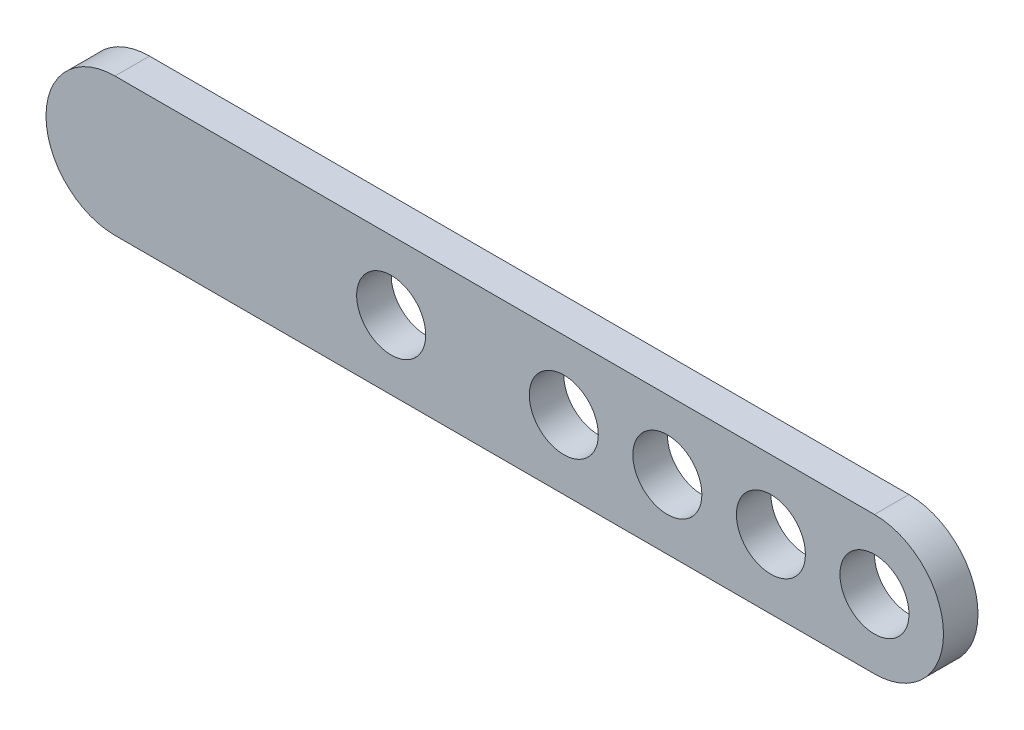
ISO-10303-21;
HEADER;
FILE_DESCRIPTION(('STEP AP214'),'2;1');
FILE_NAME('part.step','',(''),(''),'','','');
FILE_SCHEMA(('AUTOMOTIVE_DESIGN { 1 0 10303 214 1 1 1 1 }'));
ENDSEC;
DATA;
#1=APPLICATION_CONTEXT('core data for automotive mechanical design processes');
#2=APPLICATION_PROTOCOL_DEFINITION('international standard','automotive_design',2000,#1);
#3=PRODUCT_CONTEXT('',#1,'mechanical');
#4=PRODUCT('Part','Part','',(#3));
#5=PRODUCT_RELATED_PRODUCT_CATEGORY('part','',(#4));
#6=PRODUCT_DEFINITION_FORMATION('','',#4);
#7=PRODUCT_DEFINITION_CONTEXT('part definition',#1,'design');
#8=PRODUCT_DEFINITION('design','',#6,#7);
#9=PRODUCT_DEFINITION_SHAPE('','',#8);
#10=(LENGTH_UNIT() NAMED_UNIT(*) SI_UNIT(.MILLI.,.METRE.));
#11=(NAMED_UNIT(*) PLANE_ANGLE_UNIT() SI_UNIT($,.RADIAN.));
#12=(NAMED_UNIT(*) SI_UNIT($,.STERADIAN.) SOLID_ANGLE_UNIT());
#13=UNCERTAINTY_MEASURE_WITH_UNIT(LENGTH_MEASURE(1.E-05),#10,'distance_accuracy_value','');
#14=(GEOMETRIC_REPRESENTATION_CONTEXT(3) GLOBAL_UNCERTAINTY_ASSIGNED_CONTEXT((#13)) GLOBAL_UNIT_ASSIGNED_CONTEXT((#10,
#11,#12)) REPRESENTATION_CONTEXT('',''));
#15=CARTESIAN_POINT('',(0.,0.,0.));
#16=DIRECTION('',(0.,0.,1.));
#17=DIRECTION('',(1.,0.,0.));
#18=AXIS2_PLACEMENT_3D('',#15,#16,#17);
#19=CARTESIAN_POINT('',(88.9,0.,12.7));
#20=DIRECTION('',(0.,0.,-1.));
#21=DIRECTION('',(-1.,0.,0.));
#22=AXIS2_PLACEMENT_3D('',#19,#20,#21);
#23=PLANE('',#22);
#24=CARTESIAN_POINT('',(88.9,0.,12.7));
#25=DIRECTION('',(0.,0.,1.));
#26=DIRECTION('',(-1.,0.,0.));
#27=AXIS2_PLACEMENT_3D('',#24,#25,#26);
#28=CIRCLE('',#27,25.3999999999999);
#29=CARTESIAN_POINT('',(88.9,-25.3999999999999,12.7));
#30=VERTEX_POINT('',#29);
#31=CARTESIAN_POINT('',(88.9,25.4,12.7));
#32=VERTEX_POINT('',#31);
#33=EDGE_CURVE('E86',#30,#32,#28,.T.);
#34=ORIENTED_EDGE('',*,*,#33,.T.);
#35=DIRECTION('',(-1.,0.,0.));
#36=VECTOR('',#35,1.);
#37=CARTESIAN_POINT('',(-88.9,25.4,12.7));
#38=LINE('',#37,#36);
#39=CARTESIAN_POINT('',(-190.5,25.3999999999999,12.7));
#40=VERTEX_POINT('',#39);
#41=EDGE_CURVE('E80',#32,#40,#38,.T.);
#42=ORIENTED_EDGE('',*,*,#41,.T.);
#43=CARTESIAN_POINT('',(-190.5,0.,12.7));
#44=DIRECTION('',(0.,0.,1.));
#45=DIRECTION('',(1.,0.,0.));
#46=AXIS2_PLACEMENT_3D('',#43,#44,#45);
#47=CIRCLE('',#46,25.4);
#48=CARTESIAN_POINT('',(-190.5,-25.4,12.7));
#49=VERTEX_POINT('',#48);
#50=EDGE_CURVE('E83',#40,#49,#47,.T.);
#51=ORIENTED_EDGE('',*,*,#50,.T.);
#52=DIRECTION('',(1.,0.,0.));
#53=VECTOR('',#52,1.);
#54=CARTESIAN_POINT('',(-88.9,-25.4,12.7));
#55=LINE('',#54,#53);
#56=EDGE_CURVE('E52',#49,#30,#55,.T.);
#57=ORIENTED_EDGE('',*,*,#56,.T.);
#58=EDGE_LOOP('',(#34,#42,#51,#57));
#59=FACE_BOUND('',#58,.T.);
#60=CARTESIAN_POINT('',(-88.9,0.,12.7));
#61=DIRECTION('',(0.,0.,1.));
#62=DIRECTION('',(1.,0.,0.));
#63=AXIS2_PLACEMENT_3D('',#60,#61,#62);
#64=CIRCLE('',#63,12.7);
#65=CARTESIAN_POINT('',(-76.2,0.,12.7));
#66=VERTEX_POINT('',#65);
#67=EDGE_CURVE('E103',#66,#66,#64,.T.);
#68=ORIENTED_EDGE('',*,*,#67,.F.);
#69=EDGE_LOOP('',(#68));
#70=FACE_BOUND('',#69,.T.);
#71=CARTESIAN_POINT('',(88.9,0.,12.7));
#72=DIRECTION('',(0.,0.,1.));
#73=DIRECTION('',(1.,0.,0.));
#74=AXIS2_PLACEMENT_3D('',#71,#72,#73);
#75=CIRCLE('',#74,12.7);
#76=CARTESIAN_POINT('',(101.6,0.,12.7));
#77=VERTEX_POINT('',#76);
#78=EDGE_CURVE('E115',#77,#77,#75,.T.);
#79=ORIENTED_EDGE('',*,*,#78,.F.);
#80=EDGE_LOOP('',(#79));
#81=FACE_BOUND('',#80,.T.);
#82=CARTESIAN_POINT('',(50.8,-2.71494433042057E-13,12.7));
#83=DIRECTION('',(0.,0.,1.));
#84=DIRECTION('',(1.,0.,0.));
#85=AXIS2_PLACEMENT_3D('',#82,#83,#84);
#86=CIRCLE('',#85,12.7);
#87=CARTESIAN_POINT('',(63.5,-2.71494433042057E-13,12.7));
#88=VERTEX_POINT('',#87);
#89=EDGE_CURVE('E121',#88,#88,#86,.T.);
#90=ORIENTED_EDGE('',*,*,#89,.F.);
#91=EDGE_LOOP('',(#90));
#92=FACE_BOUND('',#91,.T.);
#93=CARTESIAN_POINT('',(12.7,-5.37545311061903E-13,12.7));
#94=DIRECTION('',(0.,0.,1.));
#95=DIRECTION('',(1.,0.,0.));
#96=AXIS2_PLACEMENT_3D('',#93,#94,#95);
#97=CIRCLE('',#96,12.7);
#98=CARTESIAN_POINT('',(25.4,-5.37545311061903E-13,12.7));
#99=VERTEX_POINT('',#98);
#100=EDGE_CURVE('E127',#99,#99,#97,.T.);
#101=ORIENTED_EDGE('',*,*,#100,.F.);
#102=EDGE_LOOP('',(#101));
#103=FACE_BOUND('',#102,.T.);
#104=CARTESIAN_POINT('',(-25.4,-8.0359618908175E-13,12.7));
#105=DIRECTION('',(0.,0.,1.));
#106=DIRECTION('',(1.,0.,0.));
#107=AXIS2_PLACEMENT_3D('',#104,#105,#106);
#108=CIRCLE('',#107,12.7);
#109=CARTESIAN_POINT('',(-12.7,-8.0359618908175E-13,12.7));
#110=VERTEX_POINT('',#109);
#111=EDGE_CURVE('E133',#110,#110,#108,.T.);
#112=ORIENTED_EDGE('',*,*,#111,.F.);
#113=EDGE_LOOP('',(#112));
#114=FACE_BOUND('',#113,.T.);
#115=ADVANCED_FACE('F35',(#59,#70,#81,#92,#103,#114),#23,.F.);
#116=CARTESIAN_POINT('',(88.9,0.,0.));
#117=DIRECTION('',(0.,0.,-1.));
#118=DIRECTION('',(-1.,0.,0.));
#119=AXIS2_PLACEMENT_3D('',#116,#117,#118);
#120=PLANE('',#119);
#121=CARTESIAN_POINT('',(12.7,-5.37545311061903E-13,0.));
#122=DIRECTION('',(0.,0.,1.));
#123=DIRECTION('',(1.,0.,0.));
#124=AXIS2_PLACEMENT_3D('',#121,#122,#123);
#125=CIRCLE('',#124,12.7);
#126=CARTESIAN_POINT('',(25.4,-5.37545311061903E-13,0.));
#127=VERTEX_POINT('',#126);
#128=EDGE_CURVE('E130',#127,#127,#125,.T.);
#129=ORIENTED_EDGE('',*,*,#128,.T.);
#130=EDGE_LOOP('',(#129));
#131=FACE_BOUND('',#130,.T.);
#132=CARTESIAN_POINT('',(88.9,0.,0.));
#133=DIRECTION('',(0.,0.,1.));
#134=DIRECTION('',(1.,0.,0.));
#135=AXIS2_PLACEMENT_3D('',#132,#133,#134);
#136=CIRCLE('',#135,12.7);
#137=CARTESIAN_POINT('',(101.6,0.,0.));
#138=VERTEX_POINT('',#137);
#139=EDGE_CURVE('E118',#138,#138,#136,.T.);
#140=ORIENTED_EDGE('',*,*,#139,.T.);
#141=EDGE_LOOP('',(#140));
#142=FACE_BOUND('',#141,.T.);
#143=CARTESIAN_POINT('',(88.9,0.,0.));
#144=DIRECTION('',(0.,0.,1.));
#145=DIRECTION('',(-1.,0.,0.));
#146=AXIS2_PLACEMENT_3D('',#143,#144,#145);
#147=CIRCLE('',#146,25.3999999999999);
#148=CARTESIAN_POINT('',(88.9,-25.3999999999999,0.));
#149=VERTEX_POINT('',#148);
#150=CARTESIAN_POINT('',(88.9,25.4,0.));
#151=VERTEX_POINT('',#150);
#152=EDGE_CURVE('E100',#149,#151,#147,.T.);
#153=ORIENTED_EDGE('',*,*,#152,.F.);
#154=DIRECTION('',(1.,0.,0.));
#155=VECTOR('',#154,1.);
#156=CARTESIAN_POINT('',(-88.9,-25.4,0.));
#157=LINE('',#156,#155);
#158=CARTESIAN_POINT('',(-190.5,-25.4,0.));
#159=VERTEX_POINT('',#158);
#160=EDGE_CURVE('E69',#159,#149,#157,.T.);
#161=ORIENTED_EDGE('',*,*,#160,.F.);
#162=CARTESIAN_POINT('',(-190.5,0.,0.));
#163=DIRECTION('',(0.,0.,1.));
#164=DIRECTION('',(1.,0.,0.));
#165=AXIS2_PLACEMENT_3D('',#162,#163,#164);
#166=CIRCLE('',#165,25.4);
#167=CARTESIAN_POINT('',(-190.5,25.3999999999999,0.));
#168=VERTEX_POINT('',#167);
#169=EDGE_CURVE('E105',#168,#159,#166,.T.);
#170=ORIENTED_EDGE('',*,*,#169,.F.);
#171=DIRECTION('',(-1.,0.,0.));
#172=VECTOR('',#171,1.);
#173=CARTESIAN_POINT('',(-88.9,25.4,0.));
#174=LINE('',#173,#172);
#175=EDGE_CURVE('E91',#151,#168,#174,.T.);
#176=ORIENTED_EDGE('',*,*,#175,.F.);
#177=EDGE_LOOP('',(#153,#161,#170,#176));
#178=FACE_BOUND('',#177,.T.);
#179=CARTESIAN_POINT('',(-88.9,0.,0.));
#180=DIRECTION('',(0.,0.,1.));
#181=DIRECTION('',(1.,0.,0.));
#182=AXIS2_PLACEMENT_3D('',#179,#180,#181);
#183=CIRCLE('',#182,12.7);
#184=CARTESIAN_POINT('',(-76.2,0.,0.));
#185=VERTEX_POINT('',#184);
#186=EDGE_CURVE('E112',#185,#185,#183,.T.);
#187=ORIENTED_EDGE('',*,*,#186,.T.);
#188=EDGE_LOOP('',(#187));
#189=FACE_BOUND('',#188,.T.);
#190=CARTESIAN_POINT('',(50.8,-2.71494433042057E-13,0.));
#191=DIRECTION('',(0.,0.,1.));
#192=DIRECTION('',(1.,0.,0.));
#193=AXIS2_PLACEMENT_3D('',#190,#191,#192);
#194=CIRCLE('',#193,12.7);
#195=CARTESIAN_POINT('',(63.5,-2.71494433042057E-13,0.));
#196=VERTEX_POINT('',#195);
#197=EDGE_CURVE('E124',#196,#196,#194,.T.);
#198=ORIENTED_EDGE('',*,*,#197,.T.);
#199=EDGE_LOOP('',(#198));
#200=FACE_BOUND('',#199,.T.);
#201=CARTESIAN_POINT('',(-25.4,-8.0359618908175E-13,0.));
#202=DIRECTION('',(0.,0.,1.));
#203=DIRECTION('',(1.,0.,0.));
#204=AXIS2_PLACEMENT_3D('',#201,#202,#203);
#205=CIRCLE('',#204,12.7);
#206=CARTESIAN_POINT('',(-12.7,-8.0359618908175E-13,0.));
#207=VERTEX_POINT('',#206);
#208=EDGE_CURVE('E136',#207,#207,#205,.T.);
#209=ORIENTED_EDGE('',*,*,#208,.T.);
#210=EDGE_LOOP('',(#209));
#211=FACE_BOUND('',#210,.T.);
#212=ADVANCED_FACE('F146',(#131,#142,#178,#189,#200,#211),#120,.T.);
#213=CARTESIAN_POINT('',(88.9,0.,12.7));
#214=DIRECTION('',(0.,0.,-1.));
#215=DIRECTION('',(-1.,0.,0.));
#216=AXIS2_PLACEMENT_3D('',#213,#214,#215);
#217=CYLINDRICAL_SURFACE('',#216,25.3999999999999);
#218=ORIENTED_EDGE('',*,*,#152,.T.);
#219=DIRECTION('',(0.,0.,-1.));
#220=VECTOR('',#219,1.);
#221=CARTESIAN_POINT('',(88.9,25.4,12.7));
#222=LINE('',#221,#220);
#223=EDGE_CURVE('E11',#32,#151,#222,.T.);
#224=ORIENTED_EDGE('',*,*,#223,.F.);
#225=ORIENTED_EDGE('',*,*,#33,.F.);
#226=DIRECTION('',(0.,0.,-1.));
#227=VECTOR('',#226,1.);
#228=CARTESIAN_POINT('',(88.9,-25.3999999999999,12.7));
#229=LINE('',#228,#227);
#230=EDGE_CURVE('E96',#30,#149,#229,.T.);
#231=ORIENTED_EDGE('',*,*,#230,.T.);
#232=EDGE_LOOP('',(#218,#224,#225,#231));
#233=FACE_BOUND('',#232,.T.);
#234=ADVANCED_FACE('F37',(#233),#217,.T.);
#235=CARTESIAN_POINT('',(-88.9,25.4,12.7));
#236=DIRECTION('',(0.,-1.,0.));
#237=DIRECTION('',(1.,0.,0.));
#238=AXIS2_PLACEMENT_3D('',#235,#236,#237);
#239=PLANE('',#238);
#240=ORIENTED_EDGE('',*,*,#175,.T.);
#241=DIRECTION('',(0.,0.,-1.));
#242=VECTOR('',#241,1.);
#243=CARTESIAN_POINT('',(-190.5,25.3999999999999,12.7));
#244=LINE('',#243,#242);
#245=EDGE_CURVE('E44',#40,#168,#244,.T.);
#246=ORIENTED_EDGE('',*,*,#245,.F.);
#247=ORIENTED_EDGE('',*,*,#41,.F.);
#248=ORIENTED_EDGE('',*,*,#223,.T.);
#249=EDGE_LOOP('',(#240,#246,#247,#248));
#250=FACE_BOUND('',#249,.T.);
#251=ADVANCED_FACE('F90',(#250),#239,.F.);
#252=CARTESIAN_POINT('',(-190.5,0.,12.7));
#253=DIRECTION('',(0.,0.,-1.));
#254=DIRECTION('',(-1.,0.,0.));
#255=AXIS2_PLACEMENT_3D('',#252,#253,#254);
#256=CYLINDRICAL_SURFACE('',#255,25.4);
#257=ORIENTED_EDGE('',*,*,#169,.T.);
#258=DIRECTION('',(0.,0.,-1.));
#259=VECTOR('',#258,1.);
#260=CARTESIAN_POINT('',(-190.5,-25.4,12.7));
#261=LINE('',#260,#259);
#262=EDGE_CURVE('E93',#49,#159,#261,.T.);
#263=ORIENTED_EDGE('',*,*,#262,.F.);
#264=ORIENTED_EDGE('',*,*,#50,.F.);
#265=ORIENTED_EDGE('',*,*,#245,.T.);
#266=EDGE_LOOP('',(#257,#263,#264,#265));
#267=FACE_BOUND('',#266,.T.);
#268=ADVANCED_FACE('F94',(#267),#256,.T.);
#269=CARTESIAN_POINT('',(-88.9,-25.4,12.7));
#270=DIRECTION('',(0.,1.,0.));
#271=DIRECTION('',(-1.,0.,0.));
#272=AXIS2_PLACEMENT_3D('',#269,#270,#271);
#273=PLANE('',#272);
#274=ORIENTED_EDGE('',*,*,#160,.T.);
#275=ORIENTED_EDGE('',*,*,#230,.F.);
#276=ORIENTED_EDGE('',*,*,#56,.F.);
#277=ORIENTED_EDGE('',*,*,#262,.T.);
#278=EDGE_LOOP('',(#274,#275,#276,#277));
#279=FACE_BOUND('',#278,.T.);
#280=ADVANCED_FACE('F109',(#279),#273,.F.);
#281=CARTESIAN_POINT('',(-88.9,0.,12.7));
#282=DIRECTION('',(0.,0.,-1.));
#283=DIRECTION('',(-1.,0.,0.));
#284=AXIS2_PLACEMENT_3D('',#281,#282,#283);
#285=CYLINDRICAL_SURFACE('',#284,12.7);
#286=ORIENTED_EDGE('',*,*,#67,.T.);
#287=EDGE_LOOP('',(#286));
#288=FACE_BOUND('',#287,.T.);
#289=ORIENTED_EDGE('',*,*,#186,.F.);
#290=EDGE_LOOP('',(#289));
#291=FACE_BOUND('',#290,.T.);
#292=ADVANCED_FACE('F154',(#288,#291),#285,.F.);
#293=CARTESIAN_POINT('',(88.9,0.,12.7));
#294=DIRECTION('',(0.,0.,-1.));
#295=DIRECTION('',(-1.,0.,0.));
#296=AXIS2_PLACEMENT_3D('',#293,#294,#295);
#297=CYLINDRICAL_SURFACE('',#296,12.7);
#298=ORIENTED_EDGE('',*,*,#78,.T.);
#299=EDGE_LOOP('',(#298));
#300=FACE_BOUND('',#299,.T.);
#301=ORIENTED_EDGE('',*,*,#139,.F.);
#302=EDGE_LOOP('',(#301));
#303=FACE_BOUND('',#302,.T.);
#304=ADVANCED_FACE('F206',(#300,#303),#297,.F.);
#305=CARTESIAN_POINT('',(50.8,-2.71494433042057E-13,12.7));
#306=DIRECTION('',(0.,0.,-1.));
#307=DIRECTION('',(-1.,0.,0.));
#308=AXIS2_PLACEMENT_3D('',#305,#306,#307);
#309=CYLINDRICAL_SURFACE('',#308,12.7);
#310=ORIENTED_EDGE('',*,*,#89,.T.);
#311=EDGE_LOOP('',(#310));
#312=FACE_BOUND('',#311,.T.);
#313=ORIENTED_EDGE('',*,*,#197,.F.);
#314=EDGE_LOOP('',(#313));
#315=FACE_BOUND('',#314,.T.);
#316=ADVANCED_FACE('F214',(#312,#315),#309,.F.);
#317=CARTESIAN_POINT('',(12.7,-5.37545311061903E-13,12.7));
#318=DIRECTION('',(0.,0.,-1.));
#319=DIRECTION('',(-1.,0.,0.));
#320=AXIS2_PLACEMENT_3D('',#317,#318,#319);
#321=CYLINDRICAL_SURFACE('',#320,12.7);
#322=ORIENTED_EDGE('',*,*,#100,.T.);
#323=EDGE_LOOP('',(#322));
#324=FACE_BOUND('',#323,.T.);
#325=ORIENTED_EDGE('',*,*,#128,.F.);
#326=EDGE_LOOP('',(#325));
#327=FACE_BOUND('',#326,.T.);
#328=ADVANCED_FACE('F222',(#324,#327),#321,.F.);
#329=CARTESIAN_POINT('',(-25.4,-8.0359618908175E-13,12.7));
#330=DIRECTION('',(0.,0.,-1.));
#331=DIRECTION('',(-1.,0.,0.));
#332=AXIS2_PLACEMENT_3D('',#329,#330,#331);
#333=CYLINDRICAL_SURFACE('',#332,12.7);
#334=ORIENTED_EDGE('',*,*,#111,.T.);
#335=EDGE_LOOP('',(#334));
#336=FACE_BOUND('',#335,.T.);
#337=ORIENTED_EDGE('',*,*,#208,.F.);
#338=EDGE_LOOP('',(#337));
#339=FACE_BOUND('',#338,.T.);
#340=ADVANCED_FACE('F142',(#336,#339),#333,.F.);
#341=CLOSED_SHELL('',(#115,#212,#234,#251,#268,#280,#292,#304,#316,#328,#340));
#342=MANIFOLD_SOLID_BREP('B2',#341);
#343=ADVANCED_BREP_SHAPE_REPRESENTATION('',(#18,#342),#14);
#344=SHAPE_DEFINITION_REPRESENTATION(#9,#343);
ENDSEC;
END-ISO-10303-21;
